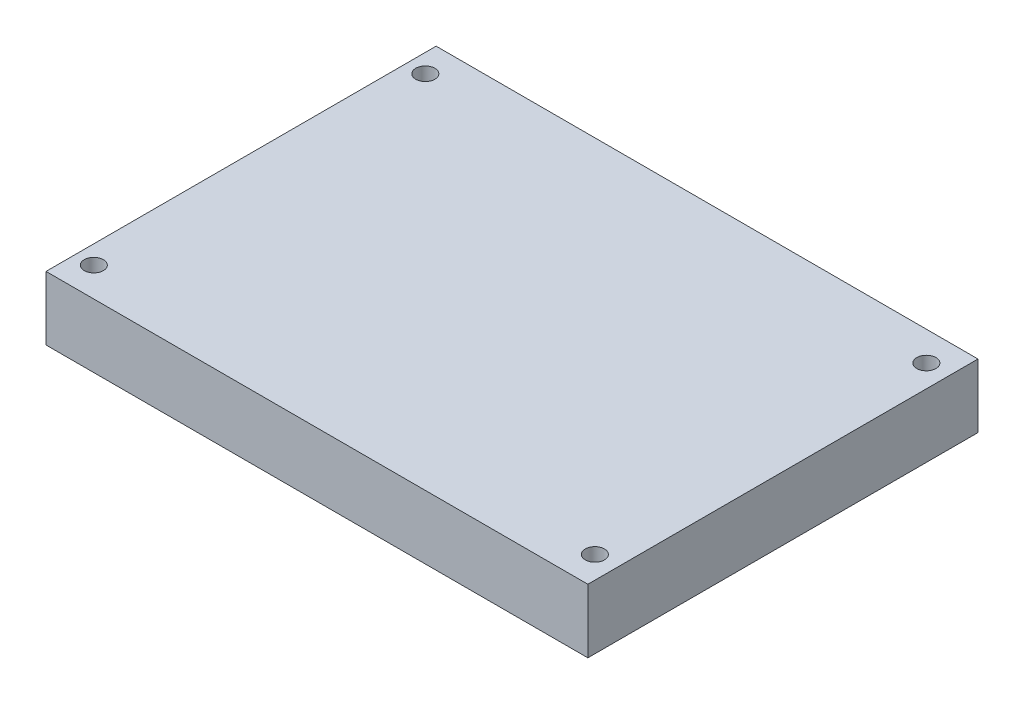
ISO-10303-21;
HEADER;
FILE_DESCRIPTION(('STEP AP214'),'2;1');
FILE_NAME('part.step','',(''),(''),'','','');
FILE_SCHEMA(('AUTOMOTIVE_DESIGN { 1 0 10303 214 1 1 1 1 }'));
ENDSEC;
DATA;
#1=APPLICATION_CONTEXT('core data for automotive mechanical design processes');
#2=APPLICATION_PROTOCOL_DEFINITION('international standard','automotive_design',2000,#1);
#3=PRODUCT_CONTEXT('',#1,'mechanical');
#4=PRODUCT('Part','Part','',(#3));
#5=PRODUCT_RELATED_PRODUCT_CATEGORY('part','',(#4));
#6=PRODUCT_DEFINITION_FORMATION('','',#4);
#7=PRODUCT_DEFINITION_CONTEXT('part definition',#1,'design');
#8=PRODUCT_DEFINITION('design','',#6,#7);
#9=PRODUCT_DEFINITION_SHAPE('','',#8);
#10=(LENGTH_UNIT() NAMED_UNIT(*) SI_UNIT(.MILLI.,.METRE.));
#11=(NAMED_UNIT(*) PLANE_ANGLE_UNIT() SI_UNIT($,.RADIAN.));
#12=(NAMED_UNIT(*) SI_UNIT($,.STERADIAN.) SOLID_ANGLE_UNIT());
#13=UNCERTAINTY_MEASURE_WITH_UNIT(LENGTH_MEASURE(1.E-05),#10,'distance_accuracy_value','');
#14=(GEOMETRIC_REPRESENTATION_CONTEXT(3) GLOBAL_UNCERTAINTY_ASSIGNED_CONTEXT((#13)) GLOBAL_UNIT_ASSIGNED_CONTEXT((#10,
#11,#12)) REPRESENTATION_CONTEXT('',''));
#15=CARTESIAN_POINT('',(0.,0.,0.));
#16=DIRECTION('',(0.,0.,1.));
#17=DIRECTION('',(1.,0.,0.));
#18=AXIS2_PLACEMENT_3D('',#15,#16,#17);
#19=CARTESIAN_POINT('',(0.,10.,0.));
#20=DIRECTION('',(0.,1.,0.));
#21=DIRECTION('',(0.,0.,1.));
#22=AXIS2_PLACEMENT_3D('',#19,#20,#21);
#23=PLANE('',#22);
#24=CARTESIAN_POINT('',(39.,10.,26.));
#25=DIRECTION('',(0.,1.,0.));
#26=DIRECTION('',(0.,0.,-1.));
#27=AXIS2_PLACEMENT_3D('',#24,#25,#26);
#28=CIRCLE('',#27,1.5);
#29=CARTESIAN_POINT('',(39.,10.,24.5));
#30=VERTEX_POINT('',#29);
#31=EDGE_CURVE('E123',#30,#30,#28,.T.);
#32=ORIENTED_EDGE('',*,*,#31,.F.);
#33=EDGE_LOOP('',(#32));
#34=FACE_BOUND('',#33,.T.);
#35=CARTESIAN_POINT('',(-39.6,10.,-26.));
#36=DIRECTION('',(0.,1.,0.));
#37=DIRECTION('',(0.,0.,1.));
#38=AXIS2_PLACEMENT_3D('',#35,#36,#37);
#39=CIRCLE('',#38,1.5);
#40=CARTESIAN_POINT('',(-39.6,10.,-24.5));
#41=VERTEX_POINT('',#40);
#42=EDGE_CURVE('E102',#41,#41,#39,.T.);
#43=ORIENTED_EDGE('',*,*,#42,.F.);
#44=EDGE_LOOP('',(#43));
#45=FACE_BOUND('',#44,.T.);
#46=DIRECTION('',(0.,0.,-1.));
#47=VECTOR('',#46,1.);
#48=CARTESIAN_POINT('',(42.5,10.,-30.6));
#49=LINE('',#48,#47);
#50=CARTESIAN_POINT('',(42.5,10.,30.6));
#51=VERTEX_POINT('',#50);
#52=CARTESIAN_POINT('',(42.5,10.,-30.6));
#53=VERTEX_POINT('',#52);
#54=EDGE_CURVE('E87',#51,#53,#49,.T.);
#55=ORIENTED_EDGE('',*,*,#54,.T.);
#56=DIRECTION('',(-1.,0.,0.));
#57=VECTOR('',#56,1.);
#58=CARTESIAN_POINT('',(-42.5,10.,-30.6));
#59=LINE('',#58,#57);
#60=CARTESIAN_POINT('',(-42.5,10.,-30.6));
#61=VERTEX_POINT('',#60);
#62=EDGE_CURVE('E82',#53,#61,#59,.T.);
#63=ORIENTED_EDGE('',*,*,#62,.T.);
#64=DIRECTION('',(0.,0.,1.));
#65=VECTOR('',#64,1.);
#66=CARTESIAN_POINT('',(-42.5,10.,-30.6));
#67=LINE('',#66,#65);
#68=CARTESIAN_POINT('',(-42.5,10.,30.6));
#69=VERTEX_POINT('',#68);
#70=EDGE_CURVE('E85',#61,#69,#67,.T.);
#71=ORIENTED_EDGE('',*,*,#70,.T.);
#72=DIRECTION('',(1.,0.,0.));
#73=VECTOR('',#72,1.);
#74=CARTESIAN_POINT('',(-42.5,10.,30.6));
#75=LINE('',#74,#73);
#76=EDGE_CURVE('E52',#69,#51,#75,.T.);
#77=ORIENTED_EDGE('',*,*,#76,.T.);
#78=EDGE_LOOP('',(#55,#63,#71,#77));
#79=FACE_BOUND('',#78,.T.);
#80=CARTESIAN_POINT('',(39.,10.,-26.));
#81=DIRECTION('',(0.,1.,0.));
#82=DIRECTION('',(0.,0.,1.));
#83=AXIS2_PLACEMENT_3D('',#80,#81,#82);
#84=CIRCLE('',#83,1.5);
#85=CARTESIAN_POINT('',(39.,10.,-24.5));
#86=VERTEX_POINT('',#85);
#87=EDGE_CURVE('E117',#86,#86,#84,.T.);
#88=ORIENTED_EDGE('',*,*,#87,.F.);
#89=EDGE_LOOP('',(#88));
#90=FACE_BOUND('',#89,.T.);
#91=CARTESIAN_POINT('',(-39.6,10.,26.));
#92=DIRECTION('',(0.,1.,0.));
#93=DIRECTION('',(0.,0.,-1.));
#94=AXIS2_PLACEMENT_3D('',#91,#92,#93);
#95=CIRCLE('',#94,1.5);
#96=CARTESIAN_POINT('',(-39.6,10.,24.5));
#97=VERTEX_POINT('',#96);
#98=EDGE_CURVE('E129',#97,#97,#95,.T.);
#99=ORIENTED_EDGE('',*,*,#98,.F.);
#100=EDGE_LOOP('',(#99));
#101=FACE_BOUND('',#100,.T.);
#102=ADVANCED_FACE('F35',(#34,#45,#79,#90,#101),#23,.T.);
#103=CARTESIAN_POINT('',(0.,0.,0.));
#104=DIRECTION('',(0.,1.,0.));
#105=DIRECTION('',(0.,0.,1.));
#106=AXIS2_PLACEMENT_3D('',#103,#104,#105);
#107=PLANE('',#106);
#108=DIRECTION('',(0.,0.,-1.));
#109=VECTOR('',#108,1.);
#110=CARTESIAN_POINT('',(42.5,0.,-30.6));
#111=LINE('',#110,#109);
#112=CARTESIAN_POINT('',(42.5,0.,30.6));
#113=VERTEX_POINT('',#112);
#114=CARTESIAN_POINT('',(42.5,0.,-30.6));
#115=VERTEX_POINT('',#114);
#116=EDGE_CURVE('E99',#113,#115,#111,.T.);
#117=ORIENTED_EDGE('',*,*,#116,.F.);
#118=DIRECTION('',(1.,0.,0.));
#119=VECTOR('',#118,1.);
#120=CARTESIAN_POINT('',(-42.5,0.,30.6));
#121=LINE('',#120,#119);
#122=CARTESIAN_POINT('',(-42.5,0.,30.6));
#123=VERTEX_POINT('',#122);
#124=EDGE_CURVE('E75',#123,#113,#121,.T.);
#125=ORIENTED_EDGE('',*,*,#124,.F.);
#126=DIRECTION('',(0.,0.,1.));
#127=VECTOR('',#126,1.);
#128=CARTESIAN_POINT('',(-42.5,0.,-30.6));
#129=LINE('',#128,#127);
#130=CARTESIAN_POINT('',(-42.5,0.,-30.6));
#131=VERTEX_POINT('',#130);
#132=EDGE_CURVE('E69',#131,#123,#129,.T.);
#133=ORIENTED_EDGE('',*,*,#132,.F.);
#134=DIRECTION('',(-1.,0.,0.));
#135=VECTOR('',#134,1.);
#136=CARTESIAN_POINT('',(-42.5,0.,-30.6));
#137=LINE('',#136,#135);
#138=EDGE_CURVE('E91',#115,#131,#137,.T.);
#139=ORIENTED_EDGE('',*,*,#138,.F.);
#140=EDGE_LOOP('',(#117,#125,#133,#139));
#141=FACE_BOUND('',#140,.T.);
#142=CARTESIAN_POINT('',(-39.6,0.,-26.));
#143=DIRECTION('',(0.,1.,0.));
#144=DIRECTION('',(0.,0.,1.));
#145=AXIS2_PLACEMENT_3D('',#142,#143,#144);
#146=CIRCLE('',#145,1.5);
#147=CARTESIAN_POINT('',(-39.6,0.,-24.5));
#148=VERTEX_POINT('',#147);
#149=EDGE_CURVE('E114',#148,#148,#146,.T.);
#150=ORIENTED_EDGE('',*,*,#149,.T.);
#151=EDGE_LOOP('',(#150));
#152=FACE_BOUND('',#151,.T.);
#153=CARTESIAN_POINT('',(39.,0.,-26.));
#154=DIRECTION('',(0.,1.,0.));
#155=DIRECTION('',(0.,0.,1.));
#156=AXIS2_PLACEMENT_3D('',#153,#154,#155);
#157=CIRCLE('',#156,1.5);
#158=CARTESIAN_POINT('',(39.,0.,-24.5));
#159=VERTEX_POINT('',#158);
#160=EDGE_CURVE('E120',#159,#159,#157,.T.);
#161=ORIENTED_EDGE('',*,*,#160,.T.);
#162=EDGE_LOOP('',(#161));
#163=FACE_BOUND('',#162,.T.);
#164=CARTESIAN_POINT('',(39.,0.,26.));
#165=DIRECTION('',(0.,1.,0.));
#166=DIRECTION('',(0.,0.,-1.));
#167=AXIS2_PLACEMENT_3D('',#164,#165,#166);
#168=CIRCLE('',#167,1.5);
#169=CARTESIAN_POINT('',(39.,0.,24.5));
#170=VERTEX_POINT('',#169);
#171=EDGE_CURVE('E126',#170,#170,#168,.T.);
#172=ORIENTED_EDGE('',*,*,#171,.T.);
#173=EDGE_LOOP('',(#172));
#174=FACE_BOUND('',#173,.T.);
#175=CARTESIAN_POINT('',(-39.6,0.,26.));
#176=DIRECTION('',(0.,1.,0.));
#177=DIRECTION('',(0.,0.,-1.));
#178=AXIS2_PLACEMENT_3D('',#175,#176,#177);
#179=CIRCLE('',#178,1.5);
#180=CARTESIAN_POINT('',(-39.6,0.,24.5));
#181=VERTEX_POINT('',#180);
#182=EDGE_CURVE('E132',#181,#181,#179,.T.);
#183=ORIENTED_EDGE('',*,*,#182,.T.);
#184=EDGE_LOOP('',(#183));
#185=FACE_BOUND('',#184,.T.);
#186=ADVANCED_FACE('F110',(#141,#152,#163,#174,#185),#107,.F.);
#187=CARTESIAN_POINT('',(42.5,10.,-30.6));
#188=DIRECTION('',(-1.,0.,0.));
#189=DIRECTION('',(0.,0.,1.));
#190=AXIS2_PLACEMENT_3D('',#187,#188,#189);
#191=PLANE('',#190);
#192=ORIENTED_EDGE('',*,*,#116,.T.);
#193=DIRECTION('',(0.,-1.,0.));
#194=VECTOR('',#193,1.);
#195=CARTESIAN_POINT('',(42.5,10.,-30.6));
#196=LINE('',#195,#194);
#197=EDGE_CURVE('E11',#53,#115,#196,.T.);
#198=ORIENTED_EDGE('',*,*,#197,.F.);
#199=ORIENTED_EDGE('',*,*,#54,.F.);
#200=DIRECTION('',(0.,-1.,0.));
#201=VECTOR('',#200,1.);
#202=CARTESIAN_POINT('',(42.5,10.,30.6));
#203=LINE('',#202,#201);
#204=EDGE_CURVE('E95',#51,#113,#203,.T.);
#205=ORIENTED_EDGE('',*,*,#204,.T.);
#206=EDGE_LOOP('',(#192,#198,#199,#205));
#207=FACE_BOUND('',#206,.T.);
#208=ADVANCED_FACE('F37',(#207),#191,.F.);
#209=CARTESIAN_POINT('',(-42.5,10.,-30.6));
#210=DIRECTION('',(0.,0.,1.));
#211=DIRECTION('',(1.,0.,0.));
#212=AXIS2_PLACEMENT_3D('',#209,#210,#211);
#213=PLANE('',#212);
#214=ORIENTED_EDGE('',*,*,#138,.T.);
#215=DIRECTION('',(0.,-1.,0.));
#216=VECTOR('',#215,1.);
#217=CARTESIAN_POINT('',(-42.5,10.,-30.6));
#218=LINE('',#217,#216);
#219=EDGE_CURVE('E44',#61,#131,#218,.T.);
#220=ORIENTED_EDGE('',*,*,#219,.F.);
#221=ORIENTED_EDGE('',*,*,#62,.F.);
#222=ORIENTED_EDGE('',*,*,#197,.T.);
#223=EDGE_LOOP('',(#214,#220,#221,#222));
#224=FACE_BOUND('',#223,.T.);
#225=ADVANCED_FACE('F90',(#224),#213,.F.);
#226=CARTESIAN_POINT('',(-42.5,10.,-30.6));
#227=DIRECTION('',(1.,0.,0.));
#228=DIRECTION('',(0.,0.,-1.));
#229=AXIS2_PLACEMENT_3D('',#226,#227,#228);
#230=PLANE('',#229);
#231=ORIENTED_EDGE('',*,*,#132,.T.);
#232=DIRECTION('',(0.,-1.,0.));
#233=VECTOR('',#232,1.);
#234=CARTESIAN_POINT('',(-42.5,10.,30.6));
#235=LINE('',#234,#233);
#236=EDGE_CURVE('E92',#69,#123,#235,.T.);
#237=ORIENTED_EDGE('',*,*,#236,.F.);
#238=ORIENTED_EDGE('',*,*,#70,.F.);
#239=ORIENTED_EDGE('',*,*,#219,.T.);
#240=EDGE_LOOP('',(#231,#237,#238,#239));
#241=FACE_BOUND('',#240,.T.);
#242=ADVANCED_FACE('F93',(#241),#230,.F.);
#243=CARTESIAN_POINT('',(-42.5,10.,30.6));
#244=DIRECTION('',(0.,0.,-1.));
#245=DIRECTION('',(-1.,0.,0.));
#246=AXIS2_PLACEMENT_3D('',#243,#244,#245);
#247=PLANE('',#246);
#248=ORIENTED_EDGE('',*,*,#124,.T.);
#249=ORIENTED_EDGE('',*,*,#204,.F.);
#250=ORIENTED_EDGE('',*,*,#76,.F.);
#251=ORIENTED_EDGE('',*,*,#236,.T.);
#252=EDGE_LOOP('',(#248,#249,#250,#251));
#253=FACE_BOUND('',#252,.T.);
#254=ADVANCED_FACE('F107',(#253),#247,.F.);
#255=CARTESIAN_POINT('',(-39.6,10.,-26.));
#256=DIRECTION('',(0.,-1.,0.));
#257=DIRECTION('',(0.,0.,-1.));
#258=AXIS2_PLACEMENT_3D('',#255,#256,#257);
#259=CYLINDRICAL_SURFACE('',#258,1.5);
#260=ORIENTED_EDGE('',*,*,#42,.T.);
#261=EDGE_LOOP('',(#260));
#262=FACE_BOUND('',#261,.T.);
#263=ORIENTED_EDGE('',*,*,#149,.F.);
#264=EDGE_LOOP('',(#263));
#265=FACE_BOUND('',#264,.T.);
#266=ADVANCED_FACE('F151',(#262,#265),#259,.F.);
#267=CARTESIAN_POINT('',(39.,10.,-26.));
#268=DIRECTION('',(0.,-1.,0.));
#269=DIRECTION('',(0.,0.,-1.));
#270=AXIS2_PLACEMENT_3D('',#267,#268,#269);
#271=CYLINDRICAL_SURFACE('',#270,1.5);
#272=ORIENTED_EDGE('',*,*,#87,.T.);
#273=EDGE_LOOP('',(#272));
#274=FACE_BOUND('',#273,.T.);
#275=ORIENTED_EDGE('',*,*,#160,.F.);
#276=EDGE_LOOP('',(#275));
#277=FACE_BOUND('',#276,.T.);
#278=ADVANCED_FACE('F197',(#274,#277),#271,.F.);
#279=CARTESIAN_POINT('',(39.,10.,26.));
#280=DIRECTION('',(0.,-1.,0.));
#281=DIRECTION('',(0.,0.,-1.));
#282=AXIS2_PLACEMENT_3D('',#279,#280,#281);
#283=CYLINDRICAL_SURFACE('',#282,1.5);
#284=ORIENTED_EDGE('',*,*,#31,.T.);
#285=EDGE_LOOP('',(#284));
#286=FACE_BOUND('',#285,.T.);
#287=ORIENTED_EDGE('',*,*,#171,.F.);
#288=EDGE_LOOP('',(#287));
#289=FACE_BOUND('',#288,.T.);
#290=ADVANCED_FACE('F205',(#286,#289),#283,.F.);
#291=CARTESIAN_POINT('',(-39.6,10.,26.));
#292=DIRECTION('',(0.,-1.,0.));
#293=DIRECTION('',(0.,0.,-1.));
#294=AXIS2_PLACEMENT_3D('',#291,#292,#293);
#295=CYLINDRICAL_SURFACE('',#294,1.5);
#296=ORIENTED_EDGE('',*,*,#98,.T.);
#297=EDGE_LOOP('',(#296));
#298=FACE_BOUND('',#297,.T.);
#299=ORIENTED_EDGE('',*,*,#182,.F.);
#300=EDGE_LOOP('',(#299));
#301=FACE_BOUND('',#300,.T.);
#302=ADVANCED_FACE('F138',(#298,#301),#295,.F.);
#303=CLOSED_SHELL('',(#102,#186,#208,#225,#242,#254,#266,#278,#290,#302));
#304=MANIFOLD_SOLID_BREP('B2',#303);
#305=ADVANCED_BREP_SHAPE_REPRESENTATION('',(#18,#304),#14);
#306=SHAPE_DEFINITION_REPRESENTATION(#9,#305);
ENDSEC;
END-ISO-10303-21;
